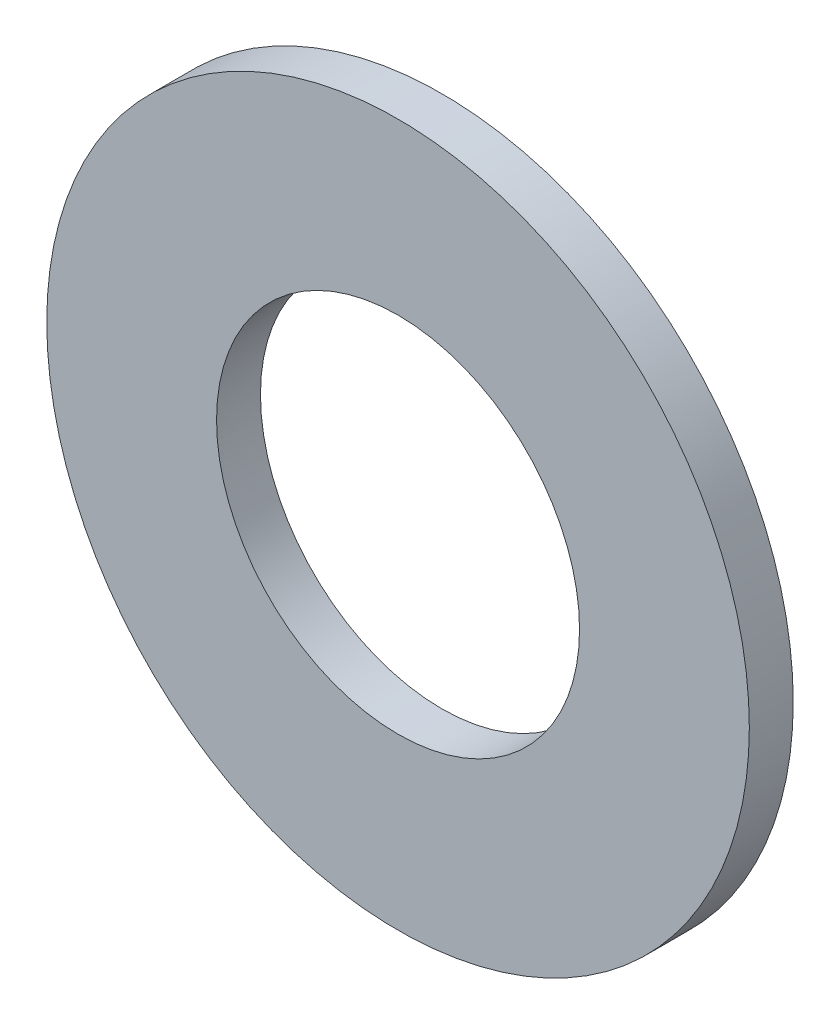
ISO-10303-21;
HEADER;
FILE_DESCRIPTION(('STEP AP214'),'2;1');
FILE_NAME('part.step','',(''),(''),'','','');
FILE_SCHEMA(('AUTOMOTIVE_DESIGN { 1 0 10303 214 1 1 1 1 }'));
ENDSEC;
DATA;
#1=APPLICATION_CONTEXT('core data for automotive mechanical design processes');
#2=APPLICATION_PROTOCOL_DEFINITION('international standard','automotive_design',2000,#1);
#3=PRODUCT_CONTEXT('',#1,'mechanical');
#4=PRODUCT('Part','Part','',(#3));
#5=PRODUCT_RELATED_PRODUCT_CATEGORY('part','',(#4));
#6=PRODUCT_DEFINITION_FORMATION('','',#4);
#7=PRODUCT_DEFINITION_CONTEXT('part definition',#1,'design');
#8=PRODUCT_DEFINITION('design','',#6,#7);
#9=PRODUCT_DEFINITION_SHAPE('','',#8);
#10=(LENGTH_UNIT() NAMED_UNIT(*) SI_UNIT(.MILLI.,.METRE.));
#11=(NAMED_UNIT(*) PLANE_ANGLE_UNIT() SI_UNIT($,.RADIAN.));
#12=(NAMED_UNIT(*) SI_UNIT($,.STERADIAN.) SOLID_ANGLE_UNIT());
#13=UNCERTAINTY_MEASURE_WITH_UNIT(LENGTH_MEASURE(1.E-05),#10,'distance_accuracy_value','');
#14=(GEOMETRIC_REPRESENTATION_CONTEXT(3) GLOBAL_UNCERTAINTY_ASSIGNED_CONTEXT((#13)) GLOBAL_UNIT_ASSIGNED_CONTEXT((#10,
#11,#12)) REPRESENTATION_CONTEXT('',''));
#15=CARTESIAN_POINT('',(0.,0.,0.));
#16=DIRECTION('',(0.,0.,1.));
#17=DIRECTION('',(1.,0.,0.));
#18=AXIS2_PLACEMENT_3D('',#15,#16,#17);
#19=CARTESIAN_POINT('',(0.,0.,0.75));
#20=DIRECTION('',(0.,0.,1.));
#21=DIRECTION('',(1.,0.,0.));
#22=AXIS2_PLACEMENT_3D('',#19,#20,#21);
#23=PLANE('',#22);
#24=CARTESIAN_POINT('',(0.,0.,0.75));
#25=DIRECTION('',(0.,0.,1.));
#26=DIRECTION('',(1.,0.,0.));
#27=AXIS2_PLACEMENT_3D('',#24,#25,#26);
#28=CIRCLE('',#27,6.);
#29=CARTESIAN_POINT('',(6.,0.,0.75));
#30=VERTEX_POINT('',#29);
#31=EDGE_CURVE('E10',#30,#30,#28,.T.);
#32=ORIENTED_EDGE('',*,*,#31,.T.);
#33=EDGE_LOOP('',(#32));
#34=FACE_BOUND('',#33,.T.);
#35=CARTESIAN_POINT('',(0.,0.,0.75));
#36=DIRECTION('',(0.,0.,1.));
#37=DIRECTION('',(1.,0.,0.));
#38=AXIS2_PLACEMENT_3D('',#35,#36,#37);
#39=CIRCLE('',#38,3.1);
#40=CARTESIAN_POINT('',(3.1,0.,0.75));
#41=VERTEX_POINT('',#40);
#42=EDGE_CURVE('E41',#41,#41,#39,.T.);
#43=ORIENTED_EDGE('',*,*,#42,.F.);
#44=EDGE_LOOP('',(#43));
#45=FACE_BOUND('',#44,.T.);
#46=ADVANCED_FACE('F30',(#34,#45),#23,.T.);
#47=CARTESIAN_POINT('',(0.,0.,0.));
#48=DIRECTION('',(0.,0.,1.));
#49=DIRECTION('',(1.,0.,0.));
#50=AXIS2_PLACEMENT_3D('',#47,#48,#49);
#51=PLANE('',#50);
#52=CARTESIAN_POINT('',(0.,0.,0.));
#53=DIRECTION('',(0.,0.,1.));
#54=DIRECTION('',(1.,0.,0.));
#55=AXIS2_PLACEMENT_3D('',#52,#53,#54);
#56=CIRCLE('',#55,6.);
#57=CARTESIAN_POINT('',(6.,0.,0.));
#58=VERTEX_POINT('',#57);
#59=EDGE_CURVE('E34',#58,#58,#56,.T.);
#60=ORIENTED_EDGE('',*,*,#59,.F.);
#61=EDGE_LOOP('',(#60));
#62=FACE_BOUND('',#61,.T.);
#63=CARTESIAN_POINT('',(0.,0.,0.));
#64=DIRECTION('',(0.,0.,1.));
#65=DIRECTION('',(1.,0.,0.));
#66=AXIS2_PLACEMENT_3D('',#63,#64,#65);
#67=CIRCLE('',#66,3.1);
#68=CARTESIAN_POINT('',(3.1,0.,0.));
#69=VERTEX_POINT('',#68);
#70=EDGE_CURVE('E43',#69,#69,#67,.T.);
#71=ORIENTED_EDGE('',*,*,#70,.T.);
#72=EDGE_LOOP('',(#71));
#73=FACE_BOUND('',#72,.T.);
#74=ADVANCED_FACE('F53',(#62,#73),#51,.F.);
#75=CARTESIAN_POINT('',(0.,0.,0.75));
#76=DIRECTION('',(0.,0.,-1.));
#77=DIRECTION('',(-1.,0.,0.));
#78=AXIS2_PLACEMENT_3D('',#75,#76,#77);
#79=CYLINDRICAL_SURFACE('',#78,6.);
#80=ORIENTED_EDGE('',*,*,#31,.F.);
#81=EDGE_LOOP('',(#80));
#82=FACE_BOUND('',#81,.T.);
#83=ORIENTED_EDGE('',*,*,#59,.T.);
#84=EDGE_LOOP('',(#83));
#85=FACE_BOUND('',#84,.T.);
#86=ADVANCED_FACE('F32',(#82,#85),#79,.T.);
#87=CARTESIAN_POINT('',(0.,0.,0.75));
#88=DIRECTION('',(0.,0.,-1.));
#89=DIRECTION('',(-1.,0.,0.));
#90=AXIS2_PLACEMENT_3D('',#87,#88,#89);
#91=CYLINDRICAL_SURFACE('',#90,3.1);
#92=ORIENTED_EDGE('',*,*,#42,.T.);
#93=EDGE_LOOP('',(#92));
#94=FACE_BOUND('',#93,.T.);
#95=ORIENTED_EDGE('',*,*,#70,.F.);
#96=EDGE_LOOP('',(#95));
#97=FACE_BOUND('',#96,.T.);
#98=ADVANCED_FACE('F49',(#94,#97),#91,.F.);
#99=CLOSED_SHELL('',(#46,#74,#86,#98));
#100=MANIFOLD_SOLID_BREP('B2',#99);
#101=ADVANCED_BREP_SHAPE_REPRESENTATION('',(#18,#100),#14);
#102=SHAPE_DEFINITION_REPRESENTATION(#9,#101);
ENDSEC;
END-ISO-10303-21;
